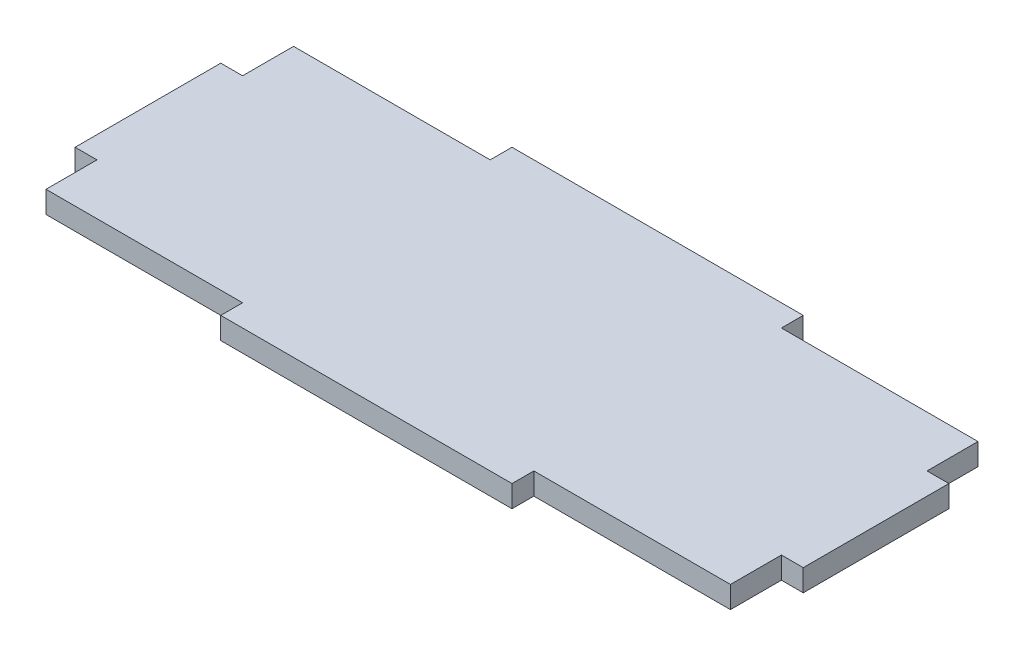
ISO-10303-21;
HEADER;
FILE_DESCRIPTION(('STEP AP214'),'2;1');
FILE_NAME('part.step','',(''),(''),'','','');
FILE_SCHEMA(('AUTOMOTIVE_DESIGN { 1 0 10303 214 1 1 1 1 }'));
ENDSEC;
DATA;
#1=APPLICATION_CONTEXT('core data for automotive mechanical design processes');
#2=APPLICATION_PROTOCOL_DEFINITION('international standard','automotive_design',2000,#1);
#3=PRODUCT_CONTEXT('',#1,'mechanical');
#4=PRODUCT('Part','Part','',(#3));
#5=PRODUCT_RELATED_PRODUCT_CATEGORY('part','',(#4));
#6=PRODUCT_DEFINITION_FORMATION('','',#4);
#7=PRODUCT_DEFINITION_CONTEXT('part definition',#1,'design');
#8=PRODUCT_DEFINITION('design','',#6,#7);
#9=PRODUCT_DEFINITION_SHAPE('','',#8);
#10=(LENGTH_UNIT() NAMED_UNIT(*) SI_UNIT(.MILLI.,.METRE.));
#11=(NAMED_UNIT(*) PLANE_ANGLE_UNIT() SI_UNIT($,.RADIAN.));
#12=(NAMED_UNIT(*) SI_UNIT($,.STERADIAN.) SOLID_ANGLE_UNIT());
#13=UNCERTAINTY_MEASURE_WITH_UNIT(LENGTH_MEASURE(1.E-05),#10,'distance_accuracy_value','');
#14=(GEOMETRIC_REPRESENTATION_CONTEXT(3) GLOBAL_UNCERTAINTY_ASSIGNED_CONTEXT((#13)) GLOBAL_UNIT_ASSIGNED_CONTEXT((#10,
#11,#12)) REPRESENTATION_CONTEXT('',''));
#15=CARTESIAN_POINT('',(0.,0.,0.));
#16=DIRECTION('',(0.,0.,1.));
#17=DIRECTION('',(1.,0.,0.));
#18=AXIS2_PLACEMENT_3D('',#15,#16,#17);
#19=CARTESIAN_POINT('',(-39.654463930962,3.,24.5318971627181));
#20=DIRECTION('',(0.,0.,-1.));
#21=DIRECTION('',(-1.,0.,0.));
#22=AXIS2_PLACEMENT_3D('',#19,#20,#21);
#23=PLANE('',#22);
#24=DIRECTION('',(1.,0.,0.));
#25=VECTOR('',#24,1.);
#26=CARTESIAN_POINT('',(-39.654463930962,0.,24.5318971627181));
#27=LINE('',#26,#25);
#28=CARTESIAN_POINT('',(-39.654463930962,0.,24.5318971627181));
#29=VERTEX_POINT('',#28);
#30=CARTESIAN_POINT('',(-12.654463930962,0.,24.5318971627181));
#31=VERTEX_POINT('',#30);
#32=EDGE_CURVE('E201',#29,#31,#27,.T.);
#33=ORIENTED_EDGE('',*,*,#32,.T.);
#34=DIRECTION('',(0.,-1.,0.));
#35=VECTOR('',#34,1.);
#36=CARTESIAN_POINT('',(-12.654463930962,3.,24.5318971627181));
#37=LINE('',#36,#35);
#38=CARTESIAN_POINT('',(-12.654463930962,3.,24.5318971627181));
#39=VERTEX_POINT('',#38);
#40=EDGE_CURVE('E11',#39,#31,#37,.T.);
#41=ORIENTED_EDGE('',*,*,#40,.F.);
#42=DIRECTION('',(1.,0.,0.));
#43=VECTOR('',#42,1.);
#44=CARTESIAN_POINT('',(-39.654463930962,3.,24.5318971627181));
#45=LINE('',#44,#43);
#46=CARTESIAN_POINT('',(-39.654463930962,3.,24.5318971627181));
#47=VERTEX_POINT('',#46);
#48=EDGE_CURVE('E239',#47,#39,#45,.T.);
#49=ORIENTED_EDGE('',*,*,#48,.F.);
#50=DIRECTION('',(0.,-1.,0.));
#51=VECTOR('',#50,1.);
#52=CARTESIAN_POINT('',(-39.654463930962,3.,24.5318971627181));
#53=LINE('',#52,#51);
#54=EDGE_CURVE('E197',#47,#29,#53,.T.);
#55=ORIENTED_EDGE('',*,*,#54,.T.);
#56=EDGE_LOOP('',(#33,#41,#49,#55));
#57=FACE_BOUND('',#56,.T.);
#58=ADVANCED_FACE('F33',(#57),#23,.F.);
#59=CARTESIAN_POINT('',(-12.654463930962,3.,27.5318971627181));
#60=DIRECTION('',(1.,0.,0.));
#61=DIRECTION('',(0.,0.,-1.));
#62=AXIS2_PLACEMENT_3D('',#59,#60,#61);
#63=PLANE('',#62);
#64=DIRECTION('',(0.,0.,1.));
#65=VECTOR('',#64,1.);
#66=CARTESIAN_POINT('',(-12.654463930962,0.,27.5318971627181));
#67=LINE('',#66,#65);
#68=CARTESIAN_POINT('',(-12.654463930962,0.,27.5318971627181));
#69=VERTEX_POINT('',#68);
#70=EDGE_CURVE('E204',#31,#69,#67,.T.);
#71=ORIENTED_EDGE('',*,*,#70,.T.);
#72=DIRECTION('',(0.,-1.,0.));
#73=VECTOR('',#72,1.);
#74=CARTESIAN_POINT('',(-12.654463930962,3.,27.5318971627181));
#75=LINE('',#74,#73);
#76=CARTESIAN_POINT('',(-12.654463930962,3.,27.5318971627181));
#77=VERTEX_POINT('',#76);
#78=EDGE_CURVE('E41',#77,#69,#75,.T.);
#79=ORIENTED_EDGE('',*,*,#78,.F.);
#80=DIRECTION('',(0.,0.,1.));
#81=VECTOR('',#80,1.);
#82=CARTESIAN_POINT('',(-12.654463930962,3.,27.5318971627181));
#83=LINE('',#82,#81);
#84=EDGE_CURVE('E128',#39,#77,#83,.T.);
#85=ORIENTED_EDGE('',*,*,#84,.F.);
#86=ORIENTED_EDGE('',*,*,#40,.T.);
#87=EDGE_LOOP('',(#71,#79,#85,#86));
#88=FACE_BOUND('',#87,.T.);
#89=ADVANCED_FACE('F357',(#88),#63,.F.);
#90=CARTESIAN_POINT('',(-12.654463930962,3.,27.5318971627181));
#91=DIRECTION('',(0.,0.,-1.));
#92=DIRECTION('',(-1.,0.,0.));
#93=AXIS2_PLACEMENT_3D('',#90,#91,#92);
#94=PLANE('',#93);
#95=DIRECTION('',(1.,0.,0.));
#96=VECTOR('',#95,1.);
#97=CARTESIAN_POINT('',(-12.654463930962,0.,27.5318971627181));
#98=LINE('',#97,#96);
#99=CARTESIAN_POINT('',(27.345536069038,0.,27.5318971627181));
#100=VERTEX_POINT('',#99);
#101=EDGE_CURVE('E206',#69,#100,#98,.T.);
#102=ORIENTED_EDGE('',*,*,#101,.T.);
#103=DIRECTION('',(0.,-1.,0.));
#104=VECTOR('',#103,1.);
#105=CARTESIAN_POINT('',(27.345536069038,3.,27.5318971627181));
#106=LINE('',#105,#104);
#107=CARTESIAN_POINT('',(27.345536069038,3.,27.5318971627181));
#108=VERTEX_POINT('',#107);
#109=EDGE_CURVE('E282',#108,#100,#106,.T.);
#110=ORIENTED_EDGE('',*,*,#109,.F.);
#111=DIRECTION('',(1.,0.,0.));
#112=VECTOR('',#111,1.);
#113=CARTESIAN_POINT('',(-12.654463930962,3.,27.5318971627181));
#114=LINE('',#113,#112);
#115=EDGE_CURVE('E290',#77,#108,#114,.T.);
#116=ORIENTED_EDGE('',*,*,#115,.F.);
#117=ORIENTED_EDGE('',*,*,#78,.T.);
#118=EDGE_LOOP('',(#102,#110,#116,#117));
#119=FACE_BOUND('',#118,.T.);
#120=ADVANCED_FACE('F288',(#119),#94,.F.);
#121=CARTESIAN_POINT('',(27.345536069038,3.,24.5318971627181));
#122=DIRECTION('',(-1.,0.,0.));
#123=DIRECTION('',(0.,0.,1.));
#124=AXIS2_PLACEMENT_3D('',#121,#122,#123);
#125=PLANE('',#124);
#126=DIRECTION('',(0.,0.,-1.));
#127=VECTOR('',#126,1.);
#128=CARTESIAN_POINT('',(27.345536069038,0.,24.5318971627181));
#129=LINE('',#128,#127);
#130=CARTESIAN_POINT('',(27.345536069038,0.,24.5318971627181));
#131=VERTEX_POINT('',#130);
#132=EDGE_CURVE('E208',#100,#131,#129,.T.);
#133=ORIENTED_EDGE('',*,*,#132,.T.);
#134=DIRECTION('',(0.,-1.,0.));
#135=VECTOR('',#134,1.);
#136=CARTESIAN_POINT('',(27.345536069038,3.,24.5318971627181));
#137=LINE('',#136,#135);
#138=CARTESIAN_POINT('',(27.345536069038,3.,24.5318971627181));
#139=VERTEX_POINT('',#138);
#140=EDGE_CURVE('E279',#139,#131,#137,.T.);
#141=ORIENTED_EDGE('',*,*,#140,.F.);
#142=DIRECTION('',(0.,0.,-1.));
#143=VECTOR('',#142,1.);
#144=CARTESIAN_POINT('',(27.345536069038,3.,24.5318971627181));
#145=LINE('',#144,#143);
#146=EDGE_CURVE('E308',#108,#139,#145,.T.);
#147=ORIENTED_EDGE('',*,*,#146,.F.);
#148=ORIENTED_EDGE('',*,*,#109,.T.);
#149=EDGE_LOOP('',(#133,#141,#147,#148));
#150=FACE_BOUND('',#149,.T.);
#151=ADVANCED_FACE('F299',(#150),#125,.F.);
#152=CARTESIAN_POINT('',(54.345536069038,3.,24.5318971627181));
#153=DIRECTION('',(0.,0.,-1.));
#154=DIRECTION('',(-1.,0.,0.));
#155=AXIS2_PLACEMENT_3D('',#152,#153,#154);
#156=PLANE('',#155);
#157=DIRECTION('',(1.,0.,0.));
#158=VECTOR('',#157,1.);
#159=CARTESIAN_POINT('',(54.345536069038,0.,24.5318971627181));
#160=LINE('',#159,#158);
#161=CARTESIAN_POINT('',(54.345536069038,0.,24.5318971627181));
#162=VERTEX_POINT('',#161);
#163=EDGE_CURVE('E210',#131,#162,#160,.T.);
#164=ORIENTED_EDGE('',*,*,#163,.T.);
#165=DIRECTION('',(0.,-1.,0.));
#166=VECTOR('',#165,1.);
#167=CARTESIAN_POINT('',(54.345536069038,3.,24.5318971627181));
#168=LINE('',#167,#166);
#169=CARTESIAN_POINT('',(54.345536069038,3.,24.5318971627181));
#170=VERTEX_POINT('',#169);
#171=EDGE_CURVE('E276',#170,#162,#168,.T.);
#172=ORIENTED_EDGE('',*,*,#171,.F.);
#173=DIRECTION('',(1.,0.,0.));
#174=VECTOR('',#173,1.);
#175=CARTESIAN_POINT('',(54.345536069038,3.,24.5318971627181));
#176=LINE('',#175,#174);
#177=EDGE_CURVE('E305',#139,#170,#176,.T.);
#178=ORIENTED_EDGE('',*,*,#177,.F.);
#179=ORIENTED_EDGE('',*,*,#140,.T.);
#180=EDGE_LOOP('',(#164,#172,#178,#179));
#181=FACE_BOUND('',#180,.T.);
#182=ADVANCED_FACE('F303',(#181),#156,.F.);
#183=CARTESIAN_POINT('',(54.345536069038,3.,17.5318971627181));
#184=DIRECTION('',(-1.,0.,0.));
#185=DIRECTION('',(0.,0.,1.));
#186=AXIS2_PLACEMENT_3D('',#183,#184,#185);
#187=PLANE('',#186);
#188=DIRECTION('',(0.,0.,-1.));
#189=VECTOR('',#188,1.);
#190=CARTESIAN_POINT('',(54.345536069038,0.,17.5318971627181));
#191=LINE('',#190,#189);
#192=CARTESIAN_POINT('',(54.345536069038,0.,17.5318971627181));
#193=VERTEX_POINT('',#192);
#194=EDGE_CURVE('E212',#162,#193,#191,.T.);
#195=ORIENTED_EDGE('',*,*,#194,.T.);
#196=DIRECTION('',(0.,-1.,0.));
#197=VECTOR('',#196,1.);
#198=CARTESIAN_POINT('',(54.345536069038,3.,17.5318971627181));
#199=LINE('',#198,#197);
#200=CARTESIAN_POINT('',(54.345536069038,3.,17.5318971627181));
#201=VERTEX_POINT('',#200);
#202=EDGE_CURVE('E273',#201,#193,#199,.T.);
#203=ORIENTED_EDGE('',*,*,#202,.F.);
#204=DIRECTION('',(0.,0.,-1.));
#205=VECTOR('',#204,1.);
#206=CARTESIAN_POINT('',(54.345536069038,3.,17.5318971627181));
#207=LINE('',#206,#205);
#208=EDGE_CURVE('E307',#170,#201,#207,.T.);
#209=ORIENTED_EDGE('',*,*,#208,.F.);
#210=ORIENTED_EDGE('',*,*,#171,.T.);
#211=EDGE_LOOP('',(#195,#203,#209,#210));
#212=FACE_BOUND('',#211,.T.);
#213=ADVANCED_FACE('F370',(#212),#187,.F.);
#214=CARTESIAN_POINT('',(57.345536069038,3.,17.5318971627181));
#215=DIRECTION('',(0.,0.,-1.));
#216=DIRECTION('',(-1.,0.,0.));
#217=AXIS2_PLACEMENT_3D('',#214,#215,#216);
#218=PLANE('',#217);
#219=DIRECTION('',(1.,0.,0.));
#220=VECTOR('',#219,1.);
#221=CARTESIAN_POINT('',(57.345536069038,0.,17.5318971627181));
#222=LINE('',#221,#220);
#223=CARTESIAN_POINT('',(57.345536069038,0.,17.5318971627181));
#224=VERTEX_POINT('',#223);
#225=EDGE_CURVE('E214',#193,#224,#222,.T.);
#226=ORIENTED_EDGE('',*,*,#225,.T.);
#227=DIRECTION('',(0.,-1.,0.));
#228=VECTOR('',#227,1.);
#229=CARTESIAN_POINT('',(57.345536069038,3.,17.5318971627181));
#230=LINE('',#229,#228);
#231=CARTESIAN_POINT('',(57.345536069038,3.,17.5318971627181));
#232=VERTEX_POINT('',#231);
#233=EDGE_CURVE('E270',#232,#224,#230,.T.);
#234=ORIENTED_EDGE('',*,*,#233,.F.);
#235=DIRECTION('',(1.,0.,0.));
#236=VECTOR('',#235,1.);
#237=CARTESIAN_POINT('',(57.345536069038,3.,17.5318971627181));
#238=LINE('',#237,#236);
#239=EDGE_CURVE('E310',#201,#232,#238,.T.);
#240=ORIENTED_EDGE('',*,*,#239,.F.);
#241=ORIENTED_EDGE('',*,*,#202,.T.);
#242=EDGE_LOOP('',(#226,#234,#240,#241));
#243=FACE_BOUND('',#242,.T.);
#244=ADVANCED_FACE('F373',(#243),#218,.F.);
#245=CARTESIAN_POINT('',(57.345536069038,3.,-2.4681028372819));
#246=DIRECTION('',(-1.,0.,0.));
#247=DIRECTION('',(0.,0.,1.));
#248=AXIS2_PLACEMENT_3D('',#245,#246,#247);
#249=PLANE('',#248);
#250=DIRECTION('',(0.,0.,-1.));
#251=VECTOR('',#250,1.);
#252=CARTESIAN_POINT('',(57.345536069038,0.,-2.4681028372819));
#253=LINE('',#252,#251);
#254=CARTESIAN_POINT('',(57.345536069038,0.,-2.4681028372819));
#255=VERTEX_POINT('',#254);
#256=EDGE_CURVE('E216',#224,#255,#253,.T.);
#257=ORIENTED_EDGE('',*,*,#256,.T.);
#258=DIRECTION('',(0.,-1.,0.));
#259=VECTOR('',#258,1.);
#260=CARTESIAN_POINT('',(57.345536069038,3.,-2.4681028372819));
#261=LINE('',#260,#259);
#262=CARTESIAN_POINT('',(57.345536069038,3.,-2.4681028372819));
#263=VERTEX_POINT('',#262);
#264=EDGE_CURVE('E267',#263,#255,#261,.T.);
#265=ORIENTED_EDGE('',*,*,#264,.F.);
#266=DIRECTION('',(0.,0.,-1.));
#267=VECTOR('',#266,1.);
#268=CARTESIAN_POINT('',(57.345536069038,3.,-2.4681028372819));
#269=LINE('',#268,#267);
#270=EDGE_CURVE('E316',#232,#263,#269,.T.);
#271=ORIENTED_EDGE('',*,*,#270,.F.);
#272=ORIENTED_EDGE('',*,*,#233,.T.);
#273=EDGE_LOOP('',(#257,#265,#271,#272));
#274=FACE_BOUND('',#273,.T.);
#275=ADVANCED_FACE('F377',(#274),#249,.F.);
#276=CARTESIAN_POINT('',(54.345536069038,3.,-2.4681028372819));
#277=DIRECTION('',(0.,0.,1.));
#278=DIRECTION('',(1.,0.,0.));
#279=AXIS2_PLACEMENT_3D('',#276,#277,#278);
#280=PLANE('',#279);
#281=DIRECTION('',(-1.,0.,0.));
#282=VECTOR('',#281,1.);
#283=CARTESIAN_POINT('',(54.345536069038,0.,-2.4681028372819));
#284=LINE('',#283,#282);
#285=CARTESIAN_POINT('',(54.345536069038,0.,-2.4681028372819));
#286=VERTEX_POINT('',#285);
#287=EDGE_CURVE('E218',#255,#286,#284,.T.);
#288=ORIENTED_EDGE('',*,*,#287,.T.);
#289=DIRECTION('',(0.,-1.,0.));
#290=VECTOR('',#289,1.);
#291=CARTESIAN_POINT('',(54.345536069038,3.,-2.4681028372819));
#292=LINE('',#291,#290);
#293=CARTESIAN_POINT('',(54.345536069038,3.,-2.4681028372819));
#294=VERTEX_POINT('',#293);
#295=EDGE_CURVE('E264',#294,#286,#292,.T.);
#296=ORIENTED_EDGE('',*,*,#295,.F.);
#297=DIRECTION('',(-1.,0.,0.));
#298=VECTOR('',#297,1.);
#299=CARTESIAN_POINT('',(54.345536069038,3.,-2.4681028372819));
#300=LINE('',#299,#298);
#301=EDGE_CURVE('E318',#263,#294,#300,.T.);
#302=ORIENTED_EDGE('',*,*,#301,.F.);
#303=ORIENTED_EDGE('',*,*,#264,.T.);
#304=EDGE_LOOP('',(#288,#296,#302,#303));
#305=FACE_BOUND('',#304,.T.);
#306=ADVANCED_FACE('F381',(#305),#280,.F.);
#307=CARTESIAN_POINT('',(54.345536069038,3.,-9.4681028372819));
#308=DIRECTION('',(-1.,0.,0.));
#309=DIRECTION('',(0.,0.,1.));
#310=AXIS2_PLACEMENT_3D('',#307,#308,#309);
#311=PLANE('',#310);
#312=DIRECTION('',(0.,0.,-1.));
#313=VECTOR('',#312,1.);
#314=CARTESIAN_POINT('',(54.345536069038,0.,-9.4681028372819));
#315=LINE('',#314,#313);
#316=CARTESIAN_POINT('',(54.345536069038,0.,-9.4681028372819));
#317=VERTEX_POINT('',#316);
#318=EDGE_CURVE('E220',#286,#317,#315,.T.);
#319=ORIENTED_EDGE('',*,*,#318,.T.);
#320=DIRECTION('',(0.,-1.,0.));
#321=VECTOR('',#320,1.);
#322=CARTESIAN_POINT('',(54.345536069038,3.,-9.4681028372819));
#323=LINE('',#322,#321);
#324=CARTESIAN_POINT('',(54.345536069038,3.,-9.4681028372819));
#325=VERTEX_POINT('',#324);
#326=EDGE_CURVE('E261',#325,#317,#323,.T.);
#327=ORIENTED_EDGE('',*,*,#326,.F.);
#328=DIRECTION('',(0.,0.,-1.));
#329=VECTOR('',#328,1.);
#330=CARTESIAN_POINT('',(54.345536069038,3.,-9.4681028372819));
#331=LINE('',#330,#329);
#332=EDGE_CURVE('E320',#294,#325,#331,.T.);
#333=ORIENTED_EDGE('',*,*,#332,.F.);
#334=ORIENTED_EDGE('',*,*,#295,.T.);
#335=EDGE_LOOP('',(#319,#327,#333,#334));
#336=FACE_BOUND('',#335,.T.);
#337=ADVANCED_FACE('F385',(#336),#311,.F.);
#338=CARTESIAN_POINT('',(54.345536069038,3.,-9.4681028372819));
#339=DIRECTION('',(0.,0.,1.));
#340=DIRECTION('',(1.,0.,0.));
#341=AXIS2_PLACEMENT_3D('',#338,#339,#340);
#342=PLANE('',#341);
#343=DIRECTION('',(-1.,0.,0.));
#344=VECTOR('',#343,1.);
#345=CARTESIAN_POINT('',(54.345536069038,0.,-9.4681028372819));
#346=LINE('',#345,#344);
#347=CARTESIAN_POINT('',(27.345536069038,0.,-9.4681028372819));
#348=VERTEX_POINT('',#347);
#349=EDGE_CURVE('E222',#317,#348,#346,.T.);
#350=ORIENTED_EDGE('',*,*,#349,.T.);
#351=DIRECTION('',(0.,-1.,0.));
#352=VECTOR('',#351,1.);
#353=CARTESIAN_POINT('',(27.345536069038,3.,-9.4681028372819));
#354=LINE('',#353,#352);
#355=CARTESIAN_POINT('',(27.345536069038,3.,-9.4681028372819));
#356=VERTEX_POINT('',#355);
#357=EDGE_CURVE('E258',#356,#348,#354,.T.);
#358=ORIENTED_EDGE('',*,*,#357,.F.);
#359=DIRECTION('',(-1.,0.,0.));
#360=VECTOR('',#359,1.);
#361=CARTESIAN_POINT('',(54.345536069038,3.,-9.4681028372819));
#362=LINE('',#361,#360);
#363=EDGE_CURVE('E322',#325,#356,#362,.T.);
#364=ORIENTED_EDGE('',*,*,#363,.F.);
#365=ORIENTED_EDGE('',*,*,#326,.T.);
#366=EDGE_LOOP('',(#350,#358,#364,#365));
#367=FACE_BOUND('',#366,.T.);
#368=ADVANCED_FACE('F389',(#367),#342,.F.);
#369=CARTESIAN_POINT('',(27.345536069038,3.,-12.4681028372819));
#370=DIRECTION('',(-1.,0.,0.));
#371=DIRECTION('',(0.,0.,1.));
#372=AXIS2_PLACEMENT_3D('',#369,#370,#371);
#373=PLANE('',#372);
#374=DIRECTION('',(0.,0.,-1.));
#375=VECTOR('',#374,1.);
#376=CARTESIAN_POINT('',(27.345536069038,0.,-12.4681028372819));
#377=LINE('',#376,#375);
#378=CARTESIAN_POINT('',(27.345536069038,0.,-12.4681028372819));
#379=VERTEX_POINT('',#378);
#380=EDGE_CURVE('E224',#348,#379,#377,.T.);
#381=ORIENTED_EDGE('',*,*,#380,.T.);
#382=DIRECTION('',(0.,-1.,0.));
#383=VECTOR('',#382,1.);
#384=CARTESIAN_POINT('',(27.345536069038,3.,-12.4681028372819));
#385=LINE('',#384,#383);
#386=CARTESIAN_POINT('',(27.345536069038,3.,-12.4681028372819));
#387=VERTEX_POINT('',#386);
#388=EDGE_CURVE('E255',#387,#379,#385,.T.);
#389=ORIENTED_EDGE('',*,*,#388,.F.);
#390=DIRECTION('',(0.,0.,-1.));
#391=VECTOR('',#390,1.);
#392=CARTESIAN_POINT('',(27.345536069038,3.,-12.4681028372819));
#393=LINE('',#392,#391);
#394=EDGE_CURVE('E324',#356,#387,#393,.T.);
#395=ORIENTED_EDGE('',*,*,#394,.F.);
#396=ORIENTED_EDGE('',*,*,#357,.T.);
#397=EDGE_LOOP('',(#381,#389,#395,#396));
#398=FACE_BOUND('',#397,.T.);
#399=ADVANCED_FACE('F393',(#398),#373,.F.);
#400=CARTESIAN_POINT('',(-12.654463930962,3.,-12.4681028372819));
#401=DIRECTION('',(0.,0.,1.));
#402=DIRECTION('',(1.,0.,0.));
#403=AXIS2_PLACEMENT_3D('',#400,#401,#402);
#404=PLANE('',#403);
#405=DIRECTION('',(-1.,0.,0.));
#406=VECTOR('',#405,1.);
#407=CARTESIAN_POINT('',(-12.654463930962,0.,-12.4681028372819));
#408=LINE('',#407,#406);
#409=CARTESIAN_POINT('',(-12.654463930962,0.,-12.4681028372819));
#410=VERTEX_POINT('',#409);
#411=EDGE_CURVE('E226',#379,#410,#408,.T.);
#412=ORIENTED_EDGE('',*,*,#411,.T.);
#413=DIRECTION('',(0.,-1.,0.));
#414=VECTOR('',#413,1.);
#415=CARTESIAN_POINT('',(-12.654463930962,3.,-12.4681028372819));
#416=LINE('',#415,#414);
#417=CARTESIAN_POINT('',(-12.654463930962,3.,-12.4681028372819));
#418=VERTEX_POINT('',#417);
#419=EDGE_CURVE('E252',#418,#410,#416,.T.);
#420=ORIENTED_EDGE('',*,*,#419,.F.);
#421=DIRECTION('',(-1.,0.,0.));
#422=VECTOR('',#421,1.);
#423=CARTESIAN_POINT('',(-12.654463930962,3.,-12.4681028372819));
#424=LINE('',#423,#422);
#425=EDGE_CURVE('E326',#387,#418,#424,.T.);
#426=ORIENTED_EDGE('',*,*,#425,.F.);
#427=ORIENTED_EDGE('',*,*,#388,.T.);
#428=EDGE_LOOP('',(#412,#420,#426,#427));
#429=FACE_BOUND('',#428,.T.);
#430=ADVANCED_FACE('F397',(#429),#404,.F.);
#431=CARTESIAN_POINT('',(-12.654463930962,3.,-12.4681028372819));
#432=DIRECTION('',(1.,0.,0.));
#433=DIRECTION('',(0.,0.,-1.));
#434=AXIS2_PLACEMENT_3D('',#431,#432,#433);
#435=PLANE('',#434);
#436=DIRECTION('',(0.,0.,1.));
#437=VECTOR('',#436,1.);
#438=CARTESIAN_POINT('',(-12.654463930962,0.,-12.4681028372819));
#439=LINE('',#438,#437);
#440=CARTESIAN_POINT('',(-12.654463930962,0.,-9.4681028372819));
#441=VERTEX_POINT('',#440);
#442=EDGE_CURVE('E228',#410,#441,#439,.T.);
#443=ORIENTED_EDGE('',*,*,#442,.T.);
#444=DIRECTION('',(0.,-1.,0.));
#445=VECTOR('',#444,1.);
#446=CARTESIAN_POINT('',(-12.654463930962,3.,-9.4681028372819));
#447=LINE('',#446,#445);
#448=CARTESIAN_POINT('',(-12.654463930962,3.,-9.4681028372819));
#449=VERTEX_POINT('',#448);
#450=EDGE_CURVE('E249',#449,#441,#447,.T.);
#451=ORIENTED_EDGE('',*,*,#450,.F.);
#452=DIRECTION('',(0.,0.,1.));
#453=VECTOR('',#452,1.);
#454=CARTESIAN_POINT('',(-12.654463930962,3.,-12.4681028372819));
#455=LINE('',#454,#453);
#456=EDGE_CURVE('E328',#418,#449,#455,.T.);
#457=ORIENTED_EDGE('',*,*,#456,.F.);
#458=ORIENTED_EDGE('',*,*,#419,.T.);
#459=EDGE_LOOP('',(#443,#451,#457,#458));
#460=FACE_BOUND('',#459,.T.);
#461=ADVANCED_FACE('F401',(#460),#435,.F.);
#462=CARTESIAN_POINT('',(-39.654463930962,3.,-9.4681028372819));
#463=DIRECTION('',(0.,0.,1.));
#464=DIRECTION('',(1.,0.,0.));
#465=AXIS2_PLACEMENT_3D('',#462,#463,#464);
#466=PLANE('',#465);
#467=DIRECTION('',(-1.,0.,0.));
#468=VECTOR('',#467,1.);
#469=CARTESIAN_POINT('',(-39.654463930962,0.,-9.4681028372819));
#470=LINE('',#469,#468);
#471=CARTESIAN_POINT('',(-39.654463930962,0.,-9.4681028372819));
#472=VERTEX_POINT('',#471);
#473=EDGE_CURVE('E230',#441,#472,#470,.T.);
#474=ORIENTED_EDGE('',*,*,#473,.T.);
#475=DIRECTION('',(0.,-1.,0.));
#476=VECTOR('',#475,1.);
#477=CARTESIAN_POINT('',(-39.654463930962,3.,-9.4681028372819));
#478=LINE('',#477,#476);
#479=CARTESIAN_POINT('',(-39.654463930962,3.,-9.4681028372819));
#480=VERTEX_POINT('',#479);
#481=EDGE_CURVE('E246',#480,#472,#478,.T.);
#482=ORIENTED_EDGE('',*,*,#481,.F.);
#483=DIRECTION('',(-1.,0.,0.));
#484=VECTOR('',#483,1.);
#485=CARTESIAN_POINT('',(-39.654463930962,3.,-9.4681028372819));
#486=LINE('',#485,#484);
#487=EDGE_CURVE('E330',#449,#480,#486,.T.);
#488=ORIENTED_EDGE('',*,*,#487,.F.);
#489=ORIENTED_EDGE('',*,*,#450,.T.);
#490=EDGE_LOOP('',(#474,#482,#488,#489));
#491=FACE_BOUND('',#490,.T.);
#492=ADVANCED_FACE('F405',(#491),#466,.F.);
#493=CARTESIAN_POINT('',(-39.654463930962,3.,-9.4681028372819));
#494=DIRECTION('',(1.,0.,0.));
#495=DIRECTION('',(0.,0.,-1.));
#496=AXIS2_PLACEMENT_3D('',#493,#494,#495);
#497=PLANE('',#496);
#498=DIRECTION('',(0.,0.,1.));
#499=VECTOR('',#498,1.);
#500=CARTESIAN_POINT('',(-39.654463930962,0.,-9.4681028372819));
#501=LINE('',#500,#499);
#502=CARTESIAN_POINT('',(-39.654463930962,0.,-2.4681028372819));
#503=VERTEX_POINT('',#502);
#504=EDGE_CURVE('E232',#472,#503,#501,.T.);
#505=ORIENTED_EDGE('',*,*,#504,.T.);
#506=DIRECTION('',(0.,-1.,0.));
#507=VECTOR('',#506,1.);
#508=CARTESIAN_POINT('',(-39.654463930962,3.,-2.4681028372819));
#509=LINE('',#508,#507);
#510=CARTESIAN_POINT('',(-39.654463930962,3.,-2.4681028372819));
#511=VERTEX_POINT('',#510);
#512=EDGE_CURVE('E243',#511,#503,#509,.T.);
#513=ORIENTED_EDGE('',*,*,#512,.F.);
#514=DIRECTION('',(0.,0.,1.));
#515=VECTOR('',#514,1.);
#516=CARTESIAN_POINT('',(-39.654463930962,3.,-9.4681028372819));
#517=LINE('',#516,#515);
#518=EDGE_CURVE('E332',#480,#511,#517,.T.);
#519=ORIENTED_EDGE('',*,*,#518,.F.);
#520=ORIENTED_EDGE('',*,*,#481,.T.);
#521=EDGE_LOOP('',(#505,#513,#519,#520));
#522=FACE_BOUND('',#521,.T.);
#523=ADVANCED_FACE('F338',(#522),#497,.F.);
#524=CARTESIAN_POINT('',(-42.654463930962,3.,-2.4681028372819));
#525=DIRECTION('',(0.,0.,1.));
#526=DIRECTION('',(1.,0.,0.));
#527=AXIS2_PLACEMENT_3D('',#524,#525,#526);
#528=PLANE('',#527);
#529=DIRECTION('',(-1.,0.,0.));
#530=VECTOR('',#529,1.);
#531=CARTESIAN_POINT('',(-42.654463930962,0.,-2.4681028372819));
#532=LINE('',#531,#530);
#533=CARTESIAN_POINT('',(-42.654463930962,0.,-2.4681028372819));
#534=VERTEX_POINT('',#533);
#535=EDGE_CURVE('E234',#503,#534,#532,.T.);
#536=ORIENTED_EDGE('',*,*,#535,.T.);
#537=DIRECTION('',(0.,-1.,0.));
#538=VECTOR('',#537,1.);
#539=CARTESIAN_POINT('',(-42.654463930962,3.,-2.4681028372819));
#540=LINE('',#539,#538);
#541=CARTESIAN_POINT('',(-42.654463930962,3.,-2.4681028372819));
#542=VERTEX_POINT('',#541);
#543=EDGE_CURVE('E192',#542,#534,#540,.T.);
#544=ORIENTED_EDGE('',*,*,#543,.F.);
#545=DIRECTION('',(-1.,0.,0.));
#546=VECTOR('',#545,1.);
#547=CARTESIAN_POINT('',(-42.654463930962,3.,-2.4681028372819));
#548=LINE('',#547,#546);
#549=EDGE_CURVE('E183',#511,#542,#548,.T.);
#550=ORIENTED_EDGE('',*,*,#549,.F.);
#551=ORIENTED_EDGE('',*,*,#512,.T.);
#552=EDGE_LOOP('',(#536,#544,#550,#551));
#553=FACE_BOUND('',#552,.T.);
#554=ADVANCED_FACE('F342',(#553),#528,.F.);
#555=CARTESIAN_POINT('',(-42.654463930962,3.,-2.4681028372819));
#556=DIRECTION('',(1.,0.,0.));
#557=DIRECTION('',(0.,0.,-1.));
#558=AXIS2_PLACEMENT_3D('',#555,#556,#557);
#559=PLANE('',#558);
#560=DIRECTION('',(0.,0.,1.));
#561=VECTOR('',#560,1.);
#562=CARTESIAN_POINT('',(-42.654463930962,0.,-2.4681028372819));
#563=LINE('',#562,#561);
#564=CARTESIAN_POINT('',(-42.654463930962,0.,17.5318971627181));
#565=VERTEX_POINT('',#564);
#566=EDGE_CURVE('E191',#534,#565,#563,.T.);
#567=ORIENTED_EDGE('',*,*,#566,.T.);
#568=DIRECTION('',(0.,-1.,0.));
#569=VECTOR('',#568,1.);
#570=CARTESIAN_POINT('',(-42.654463930962,3.,17.5318971627181));
#571=LINE('',#570,#569);
#572=CARTESIAN_POINT('',(-42.654463930962,3.,17.5318971627181));
#573=VERTEX_POINT('',#572);
#574=EDGE_CURVE('E188',#573,#565,#571,.T.);
#575=ORIENTED_EDGE('',*,*,#574,.F.);
#576=DIRECTION('',(0.,0.,1.));
#577=VECTOR('',#576,1.);
#578=CARTESIAN_POINT('',(-42.654463930962,3.,-2.4681028372819));
#579=LINE('',#578,#577);
#580=EDGE_CURVE('E177',#542,#573,#579,.T.);
#581=ORIENTED_EDGE('',*,*,#580,.F.);
#582=ORIENTED_EDGE('',*,*,#543,.T.);
#583=EDGE_LOOP('',(#567,#575,#581,#582));
#584=FACE_BOUND('',#583,.T.);
#585=ADVANCED_FACE('F189',(#584),#559,.F.);
#586=CARTESIAN_POINT('',(-42.654463930962,3.,17.5318971627181));
#587=DIRECTION('',(0.,0.,-1.));
#588=DIRECTION('',(-1.,0.,0.));
#589=AXIS2_PLACEMENT_3D('',#586,#587,#588);
#590=PLANE('',#589);
#591=DIRECTION('',(1.,0.,0.));
#592=VECTOR('',#591,1.);
#593=CARTESIAN_POINT('',(-42.654463930962,0.,17.5318971627181));
#594=LINE('',#593,#592);
#595=CARTESIAN_POINT('',(-39.654463930962,0.,17.5318971627181));
#596=VERTEX_POINT('',#595);
#597=EDGE_CURVE('E114',#565,#596,#594,.T.);
#598=ORIENTED_EDGE('',*,*,#597,.T.);
#599=DIRECTION('',(0.,-1.,0.));
#600=VECTOR('',#599,1.);
#601=CARTESIAN_POINT('',(-39.654463930962,3.,17.5318971627181));
#602=LINE('',#601,#600);
#603=CARTESIAN_POINT('',(-39.654463930962,3.,17.5318971627181));
#604=VERTEX_POINT('',#603);
#605=EDGE_CURVE('E193',#604,#596,#602,.T.);
#606=ORIENTED_EDGE('',*,*,#605,.F.);
#607=DIRECTION('',(1.,0.,0.));
#608=VECTOR('',#607,1.);
#609=CARTESIAN_POINT('',(-42.654463930962,3.,17.5318971627181));
#610=LINE('',#609,#608);
#611=EDGE_CURVE('E181',#573,#604,#610,.T.);
#612=ORIENTED_EDGE('',*,*,#611,.F.);
#613=ORIENTED_EDGE('',*,*,#574,.T.);
#614=EDGE_LOOP('',(#598,#606,#612,#613));
#615=FACE_BOUND('',#614,.T.);
#616=ADVANCED_FACE('F195',(#615),#590,.F.);
#617=CARTESIAN_POINT('',(-39.654463930962,3.,24.5318971627181));
#618=DIRECTION('',(1.,0.,0.));
#619=DIRECTION('',(0.,0.,-1.));
#620=AXIS2_PLACEMENT_3D('',#617,#618,#619);
#621=PLANE('',#620);
#622=DIRECTION('',(0.,0.,1.));
#623=VECTOR('',#622,1.);
#624=CARTESIAN_POINT('',(-39.654463930962,0.,24.5318971627181));
#625=LINE('',#624,#623);
#626=EDGE_CURVE('E120',#596,#29,#625,.T.);
#627=ORIENTED_EDGE('',*,*,#626,.T.);
#628=ORIENTED_EDGE('',*,*,#54,.F.);
#629=DIRECTION('',(0.,0.,1.));
#630=VECTOR('',#629,1.);
#631=CARTESIAN_POINT('',(-39.654463930962,3.,24.5318971627181));
#632=LINE('',#631,#630);
#633=EDGE_CURVE('E49',#604,#47,#632,.T.);
#634=ORIENTED_EDGE('',*,*,#633,.F.);
#635=ORIENTED_EDGE('',*,*,#605,.T.);
#636=EDGE_LOOP('',(#627,#628,#634,#635));
#637=FACE_BOUND('',#636,.T.);
#638=ADVANCED_FACE('F346',(#637),#621,.F.);
#639=CARTESIAN_POINT('',(0.,3.,0.));
#640=DIRECTION('',(0.,1.,0.));
#641=DIRECTION('',(0.,0.,1.));
#642=AXIS2_PLACEMENT_3D('',#639,#640,#641);
#643=PLANE('',#642);
#644=ORIENTED_EDGE('',*,*,#48,.T.);
#645=ORIENTED_EDGE('',*,*,#84,.T.);
#646=ORIENTED_EDGE('',*,*,#115,.T.);
#647=ORIENTED_EDGE('',*,*,#146,.T.);
#648=ORIENTED_EDGE('',*,*,#177,.T.);
#649=ORIENTED_EDGE('',*,*,#208,.T.);
#650=ORIENTED_EDGE('',*,*,#239,.T.);
#651=ORIENTED_EDGE('',*,*,#270,.T.);
#652=ORIENTED_EDGE('',*,*,#301,.T.);
#653=ORIENTED_EDGE('',*,*,#332,.T.);
#654=ORIENTED_EDGE('',*,*,#363,.T.);
#655=ORIENTED_EDGE('',*,*,#394,.T.);
#656=ORIENTED_EDGE('',*,*,#425,.T.);
#657=ORIENTED_EDGE('',*,*,#456,.T.);
#658=ORIENTED_EDGE('',*,*,#487,.T.);
#659=ORIENTED_EDGE('',*,*,#518,.T.);
#660=ORIENTED_EDGE('',*,*,#549,.T.);
#661=ORIENTED_EDGE('',*,*,#580,.T.);
#662=ORIENTED_EDGE('',*,*,#611,.T.);
#663=ORIENTED_EDGE('',*,*,#633,.T.);
#664=EDGE_LOOP('',(#644,#645,#646,#647,#648,#649,#650,#651,#652,#653,#654,#655,#656,#657,#658,
#659,#660,#661,#662,#663));
#665=FACE_BOUND('',#664,.T.);
#666=ADVANCED_FACE('F179',(#665),#643,.T.);
#667=CARTESIAN_POINT('',(0.,0.,0.));
#668=DIRECTION('',(0.,1.,0.));
#669=DIRECTION('',(0.,0.,1.));
#670=AXIS2_PLACEMENT_3D('',#667,#668,#669);
#671=PLANE('',#670);
#672=ORIENTED_EDGE('',*,*,#32,.F.);
#673=ORIENTED_EDGE('',*,*,#626,.F.);
#674=ORIENTED_EDGE('',*,*,#597,.F.);
#675=ORIENTED_EDGE('',*,*,#566,.F.);
#676=ORIENTED_EDGE('',*,*,#535,.F.);
#677=ORIENTED_EDGE('',*,*,#504,.F.);
#678=ORIENTED_EDGE('',*,*,#473,.F.);
#679=ORIENTED_EDGE('',*,*,#442,.F.);
#680=ORIENTED_EDGE('',*,*,#411,.F.);
#681=ORIENTED_EDGE('',*,*,#380,.F.);
#682=ORIENTED_EDGE('',*,*,#349,.F.);
#683=ORIENTED_EDGE('',*,*,#318,.F.);
#684=ORIENTED_EDGE('',*,*,#287,.F.);
#685=ORIENTED_EDGE('',*,*,#256,.F.);
#686=ORIENTED_EDGE('',*,*,#225,.F.);
#687=ORIENTED_EDGE('',*,*,#194,.F.);
#688=ORIENTED_EDGE('',*,*,#163,.F.);
#689=ORIENTED_EDGE('',*,*,#132,.F.);
#690=ORIENTED_EDGE('',*,*,#101,.F.);
#691=ORIENTED_EDGE('',*,*,#70,.F.);
#692=EDGE_LOOP('',(#672,#673,#674,#675,#676,#677,#678,#679,#680,#681,#682,#683,#684,#685,#686,
#687,#688,#689,#690,#691));
#693=FACE_BOUND('',#692,.T.);
#694=ADVANCED_FACE('F294',(#693),#671,.F.);
#695=CLOSED_SHELL('',(#58,#89,#120,#151,#182,#213,#244,#275,#306,#337,#368,#399,#430,#461,#492,
#523,#554,#585,#616,#638,#666,#694));
#696=MANIFOLD_SOLID_BREP('B2',#695);
#697=ADVANCED_BREP_SHAPE_REPRESENTATION('',(#18,#696),#14);
#698=SHAPE_DEFINITION_REPRESENTATION(#9,#697);
ENDSEC;
END-ISO-10303-21;
